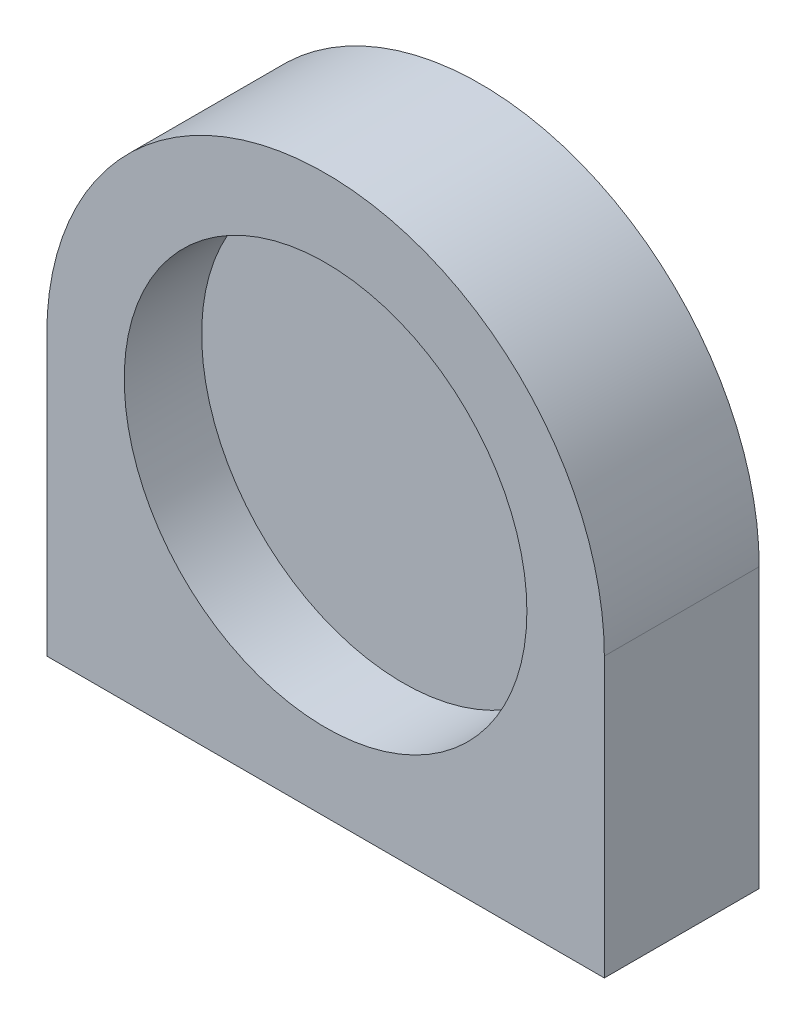
ISO-10303-21;
HEADER;
FILE_DESCRIPTION(('STEP AP214'),'2;1');
FILE_NAME('part.step','',(''),(''),'','','');
FILE_SCHEMA(('AUTOMOTIVE_DESIGN { 1 0 10303 214 1 1 1 1 }'));
ENDSEC;
DATA;
#1=APPLICATION_CONTEXT('core data for automotive mechanical design processes');
#2=APPLICATION_PROTOCOL_DEFINITION('international standard','automotive_design',2000,#1);
#3=PRODUCT_CONTEXT('',#1,'mechanical');
#4=PRODUCT('Part','Part','',(#3));
#5=PRODUCT_RELATED_PRODUCT_CATEGORY('part','',(#4));
#6=PRODUCT_DEFINITION_FORMATION('','',#4);
#7=PRODUCT_DEFINITION_CONTEXT('part definition',#1,'design');
#8=PRODUCT_DEFINITION('design','',#6,#7);
#9=PRODUCT_DEFINITION_SHAPE('','',#8);
#10=(LENGTH_UNIT() NAMED_UNIT(*) SI_UNIT(.MILLI.,.METRE.));
#11=(NAMED_UNIT(*) PLANE_ANGLE_UNIT() SI_UNIT($,.RADIAN.));
#12=(NAMED_UNIT(*) SI_UNIT($,.STERADIAN.) SOLID_ANGLE_UNIT());
#13=UNCERTAINTY_MEASURE_WITH_UNIT(LENGTH_MEASURE(1.E-05),#10,'distance_accuracy_value','');
#14=(GEOMETRIC_REPRESENTATION_CONTEXT(3) GLOBAL_UNCERTAINTY_ASSIGNED_CONTEXT((#13)) GLOBAL_UNIT_ASSIGNED_CONTEXT((#10,
#11,#12)) REPRESENTATION_CONTEXT('',''));
#15=CARTESIAN_POINT('',(0.,0.,0.));
#16=DIRECTION('',(0.,0.,1.));
#17=DIRECTION('',(1.,0.,0.));
#18=AXIS2_PLACEMENT_3D('',#15,#16,#17);
#19=CARTESIAN_POINT('',(0.,0.,2.5));
#20=DIRECTION('',(0.,0.,1.));
#21=DIRECTION('',(1.,0.,0.));
#22=AXIS2_PLACEMENT_3D('',#19,#20,#21);
#23=PLANE('',#22);
#24=CARTESIAN_POINT('',(0.,0.,2.5));
#25=DIRECTION('',(0.,0.,1.));
#26=DIRECTION('',(1.,0.,0.));
#27=AXIS2_PLACEMENT_3D('',#24,#25,#26);
#28=CIRCLE('',#27,9.);
#29=CARTESIAN_POINT('',(9.,0.,2.5));
#30=VERTEX_POINT('',#29);
#31=CARTESIAN_POINT('',(-9.,0.,2.5));
#32=VERTEX_POINT('',#31);
#33=EDGE_CURVE('E81',#30,#32,#28,.T.);
#34=ORIENTED_EDGE('',*,*,#33,.T.);
#35=DIRECTION('',(0.,-1.,0.));
#36=VECTOR('',#35,1.);
#37=CARTESIAN_POINT('',(-9.,0.,2.5));
#38=LINE('',#37,#36);
#39=CARTESIAN_POINT('',(-9.,-9.,2.5));
#40=VERTEX_POINT('',#39);
#41=EDGE_CURVE('E108',#32,#40,#38,.T.);
#42=ORIENTED_EDGE('',*,*,#41,.T.);
#43=DIRECTION('',(1.,0.,0.));
#44=VECTOR('',#43,1.);
#45=CARTESIAN_POINT('',(-9.,-9.,2.5));
#46=LINE('',#45,#44);
#47=CARTESIAN_POINT('',(9.,-9.,2.5));
#48=VERTEX_POINT('',#47);
#49=EDGE_CURVE('E56',#40,#48,#46,.T.);
#50=ORIENTED_EDGE('',*,*,#49,.T.);
#51=DIRECTION('',(0.,1.,0.));
#52=VECTOR('',#51,1.);
#53=CARTESIAN_POINT('',(9.,-9.,2.5));
#54=LINE('',#53,#52);
#55=EDGE_CURVE('E51',#48,#30,#54,.T.);
#56=ORIENTED_EDGE('',*,*,#55,.T.);
#57=EDGE_LOOP('',(#34,#42,#50,#56));
#58=FACE_BOUND('',#57,.T.);
#59=CARTESIAN_POINT('',(0.,0.,2.5));
#60=DIRECTION('',(0.,0.,1.));
#61=DIRECTION('',(1.,0.,0.));
#62=AXIS2_PLACEMENT_3D('',#59,#60,#61);
#63=CIRCLE('',#62,6.5);
#64=CARTESIAN_POINT('',(6.5,0.,2.5));
#65=VERTEX_POINT('',#64);
#66=EDGE_CURVE('E102',#65,#65,#63,.T.);
#67=ORIENTED_EDGE('',*,*,#66,.F.);
#68=EDGE_LOOP('',(#67));
#69=FACE_BOUND('',#68,.T.);
#70=ADVANCED_FACE('F36',(#58,#69),#23,.T.);
#71=CARTESIAN_POINT('',(0.,0.,2.5));
#72=DIRECTION('',(0.,0.,-1.));
#73=DIRECTION('',(-1.,0.,0.));
#74=AXIS2_PLACEMENT_3D('',#71,#72,#73);
#75=CYLINDRICAL_SURFACE('',#74,9.);
#76=DIRECTION('',(0.,0.,-1.));
#77=VECTOR('',#76,1.);
#78=CARTESIAN_POINT('',(9.,0.,2.5));
#79=LINE('',#78,#77);
#80=CARTESIAN_POINT('',(9.,0.,-2.5));
#81=VERTEX_POINT('',#80);
#82=EDGE_CURVE('E76',#30,#81,#79,.T.);
#83=ORIENTED_EDGE('',*,*,#82,.T.);
#84=CARTESIAN_POINT('',(0.,0.,-2.5));
#85=DIRECTION('',(0.,0.,-1.));
#86=DIRECTION('',(-1.,0.,0.));
#87=AXIS2_PLACEMENT_3D('',#84,#85,#86);
#88=CIRCLE('',#87,9.);
#89=CARTESIAN_POINT('',(-9.,0.,-2.5));
#90=VERTEX_POINT('',#89);
#91=EDGE_CURVE('E80',#90,#81,#88,.T.);
#92=ORIENTED_EDGE('',*,*,#91,.F.);
#93=DIRECTION('',(0.,0.,-1.));
#94=VECTOR('',#93,1.);
#95=CARTESIAN_POINT('',(-9.,0.,2.5));
#96=LINE('',#95,#94);
#97=EDGE_CURVE('E11',#32,#90,#96,.T.);
#98=ORIENTED_EDGE('',*,*,#97,.F.);
#99=ORIENTED_EDGE('',*,*,#33,.F.);
#100=EDGE_LOOP('',(#83,#92,#98,#99));
#101=FACE_BOUND('',#100,.T.);
#102=ADVANCED_FACE('F38',(#101),#75,.T.);
#103=CARTESIAN_POINT('',(-9.,0.,2.5));
#104=DIRECTION('',(1.,0.,0.));
#105=DIRECTION('',(0.,0.,-1.));
#106=AXIS2_PLACEMENT_3D('',#103,#104,#105);
#107=PLANE('',#106);
#108=ORIENTED_EDGE('',*,*,#97,.T.);
#109=DIRECTION('',(0.,1.,0.));
#110=VECTOR('',#109,1.);
#111=CARTESIAN_POINT('',(-9.,-9.,-2.5));
#112=LINE('',#111,#110);
#113=CARTESIAN_POINT('',(-9.,-9.,-2.5));
#114=VERTEX_POINT('',#113);
#115=EDGE_CURVE('E96',#114,#90,#112,.T.);
#116=ORIENTED_EDGE('',*,*,#115,.F.);
#117=DIRECTION('',(0.,0.,-1.));
#118=VECTOR('',#117,1.);
#119=CARTESIAN_POINT('',(-9.,-9.,2.5));
#120=LINE('',#119,#118);
#121=EDGE_CURVE('E44',#40,#114,#120,.T.);
#122=ORIENTED_EDGE('',*,*,#121,.F.);
#123=ORIENTED_EDGE('',*,*,#41,.F.);
#124=EDGE_LOOP('',(#108,#116,#122,#123));
#125=FACE_BOUND('',#124,.T.);
#126=ADVANCED_FACE('F116',(#125),#107,.F.);
#127=CARTESIAN_POINT('',(-9.,-9.,2.5));
#128=DIRECTION('',(0.,1.,0.));
#129=DIRECTION('',(0.,0.,1.));
#130=AXIS2_PLACEMENT_3D('',#127,#128,#129);
#131=PLANE('',#130);
#132=ORIENTED_EDGE('',*,*,#121,.T.);
#133=DIRECTION('',(-1.,0.,0.));
#134=VECTOR('',#133,1.);
#135=CARTESIAN_POINT('',(9.,-9.,-2.5));
#136=LINE('',#135,#134);
#137=CARTESIAN_POINT('',(9.,-9.,-2.5));
#138=VERTEX_POINT('',#137);
#139=EDGE_CURVE('E91',#138,#114,#136,.T.);
#140=ORIENTED_EDGE('',*,*,#139,.F.);
#141=DIRECTION('',(0.,0.,-1.));
#142=VECTOR('',#141,1.);
#143=CARTESIAN_POINT('',(9.,-9.,2.5));
#144=LINE('',#143,#142);
#145=EDGE_CURVE('E83',#48,#138,#144,.T.);
#146=ORIENTED_EDGE('',*,*,#145,.F.);
#147=ORIENTED_EDGE('',*,*,#49,.F.);
#148=EDGE_LOOP('',(#132,#140,#146,#147));
#149=FACE_BOUND('',#148,.T.);
#150=ADVANCED_FACE('F114',(#149),#131,.F.);
#151=CARTESIAN_POINT('',(9.,-9.,2.5));
#152=DIRECTION('',(-1.,0.,0.));
#153=DIRECTION('',(0.,0.,1.));
#154=AXIS2_PLACEMENT_3D('',#151,#152,#153);
#155=PLANE('',#154);
#156=ORIENTED_EDGE('',*,*,#145,.T.);
#157=DIRECTION('',(0.,-1.,0.));
#158=VECTOR('',#157,1.);
#159=CARTESIAN_POINT('',(9.,0.,-2.5));
#160=LINE('',#159,#158);
#161=EDGE_CURVE('E86',#81,#138,#160,.T.);
#162=ORIENTED_EDGE('',*,*,#161,.F.);
#163=ORIENTED_EDGE('',*,*,#82,.F.);
#164=ORIENTED_EDGE('',*,*,#55,.F.);
#165=EDGE_LOOP('',(#156,#162,#163,#164));
#166=FACE_BOUND('',#165,.T.);
#167=ADVANCED_FACE('F87',(#166),#155,.F.);
#168=CARTESIAN_POINT('',(0.,0.,2.5));
#169=DIRECTION('',(0.,0.,-1.));
#170=DIRECTION('',(-1.,0.,0.));
#171=AXIS2_PLACEMENT_3D('',#168,#169,#170);
#172=CYLINDRICAL_SURFACE('',#171,6.5);
#173=ORIENTED_EDGE('',*,*,#66,.T.);
#174=EDGE_LOOP('',(#173));
#175=FACE_BOUND('',#174,.T.);
#176=CARTESIAN_POINT('',(0.,0.,0.));
#177=DIRECTION('',(0.,0.,1.));
#178=DIRECTION('',(1.,0.,0.));
#179=AXIS2_PLACEMENT_3D('',#176,#177,#178);
#180=CIRCLE('',#179,6.5);
#181=CARTESIAN_POINT('',(6.5,0.,0.));
#182=VERTEX_POINT('',#181);
#183=EDGE_CURVE('E101',#182,#182,#180,.T.);
#184=ORIENTED_EDGE('',*,*,#183,.F.);
#185=EDGE_LOOP('',(#184));
#186=FACE_BOUND('',#185,.T.);
#187=ADVANCED_FACE('F122',(#175,#186),#172,.F.);
#188=CARTESIAN_POINT('',(0.,0.,0.));
#189=DIRECTION('',(0.,0.,-1.));
#190=DIRECTION('',(-1.,0.,0.));
#191=AXIS2_PLACEMENT_3D('',#188,#189,#190);
#192=PLANE('',#191);
#193=ORIENTED_EDGE('',*,*,#183,.T.);
#194=EDGE_LOOP('',(#193));
#195=FACE_BOUND('',#194,.T.);
#196=ADVANCED_FACE('F125',(#195),#192,.F.);
#197=CARTESIAN_POINT('',(0.,0.,-2.5));
#198=DIRECTION('',(0.,0.,-1.));
#199=DIRECTION('',(-1.,0.,0.));
#200=AXIS2_PLACEMENT_3D('',#197,#198,#199);
#201=PLANE('',#200);
#202=ORIENTED_EDGE('',*,*,#91,.T.);
#203=ORIENTED_EDGE('',*,*,#161,.T.);
#204=ORIENTED_EDGE('',*,*,#139,.T.);
#205=ORIENTED_EDGE('',*,*,#115,.T.);
#206=EDGE_LOOP('',(#202,#203,#204,#205));
#207=FACE_BOUND('',#206,.T.);
#208=ADVANCED_FACE('F94',(#207),#201,.T.);
#209=CLOSED_SHELL('',(#70,#102,#126,#150,#167,#187,#196,#208));
#210=MANIFOLD_SOLID_BREP('B2',#209);
#211=ADVANCED_BREP_SHAPE_REPRESENTATION('',(#18,#210),#14);
#212=SHAPE_DEFINITION_REPRESENTATION(#9,#211);
ENDSEC;
END-ISO-10303-21;
